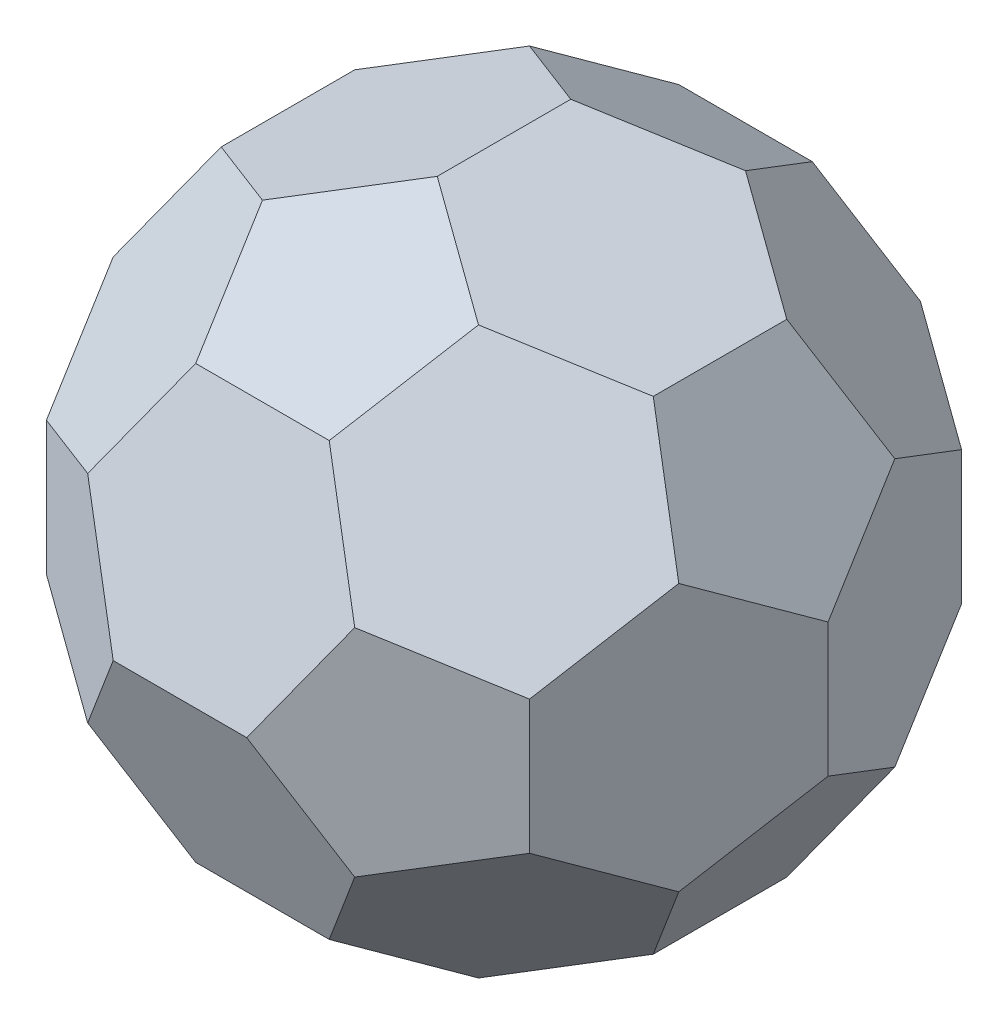
ISO-10303-21;
HEADER;
FILE_DESCRIPTION(('STEP AP214'),'2;1');
FILE_NAME('part.step','',(''),(''),'','','');
FILE_SCHEMA(('AUTOMOTIVE_DESIGN { 1 0 10303 214 1 1 1 1 }'));
ENDSEC;
DATA;
#1=APPLICATION_CONTEXT('core data for automotive mechanical design processes');
#2=APPLICATION_PROTOCOL_DEFINITION('international standard','automotive_design',2000,#1);
#3=PRODUCT_CONTEXT('',#1,'mechanical');
#4=PRODUCT('Part','Part','',(#3));
#5=PRODUCT_RELATED_PRODUCT_CATEGORY('part','',(#4));
#6=PRODUCT_DEFINITION_FORMATION('','',#4);
#7=PRODUCT_DEFINITION_CONTEXT('part definition',#1,'design');
#8=PRODUCT_DEFINITION('design','',#6,#7);
#9=PRODUCT_DEFINITION_SHAPE('','',#8);
#10=(LENGTH_UNIT() NAMED_UNIT(*) SI_UNIT(.MILLI.,.METRE.));
#11=(NAMED_UNIT(*) PLANE_ANGLE_UNIT() SI_UNIT($,.RADIAN.));
#12=(NAMED_UNIT(*) SI_UNIT($,.STERADIAN.) SOLID_ANGLE_UNIT());
#13=UNCERTAINTY_MEASURE_WITH_UNIT(LENGTH_MEASURE(1.E-05),#10,'distance_accuracy_value','');
#14=(GEOMETRIC_REPRESENTATION_CONTEXT(3) GLOBAL_UNCERTAINTY_ASSIGNED_CONTEXT((#13)) GLOBAL_UNIT_ASSIGNED_CONTEXT((#10,
#11,#12)) REPRESENTATION_CONTEXT('',''));
#15=CARTESIAN_POINT('',(0.,0.,0.));
#16=DIRECTION('',(0.,0.,1.));
#17=DIRECTION('',(1.,0.,0.));
#18=AXIS2_PLACEMENT_3D('',#15,#16,#17);
#19=CARTESIAN_POINT('',(29.0744913757677,0.,-47.0435152516077));
#20=DIRECTION('',(0.,0.356822089773093,0.934172358962715));
#21=DIRECTION('',(0.925614793410956,0.353553390593278,-0.135045378368864));
#22=AXIS2_PLACEMENT_3D('',#19,#20,#21);
#23=PLANE('',#22);
#24=DIRECTION('',(-0.500000000000016,0.809016994374937,-0.309016994374948));
#25=VECTOR('',#24,1.);
#26=CARTESIAN_POINT('',(14.5372456878839,-7.84058587526825,-44.0486779389676));
#27=LINE('',#26,#25);
#28=CARTESIAN_POINT('',(19.3829942505119,-15.6811717505359,-41.0538406263277));
#29=VERTEX_POINT('',#28);
#30=CARTESIAN_POINT('',(9.69149712525565,0.,-47.0435152516077));
#31=VERTEX_POINT('',#30);
#32=EDGE_CURVE('E286',#29,#31,#27,.T.);
#33=ORIENTED_EDGE('',*,*,#32,.F.);
#34=DIRECTION('',(-0.499999999999994,-0.80901699437495,0.309016994374951));
#35=VECTOR('',#34,1.);
#36=CARTESIAN_POINT('',(29.0744913757676,0.,-47.0435152516078));
#37=LINE('',#36,#35);
#38=CARTESIAN_POINT('',(9.69149712525601,-31.3623435010721,-35.0641660010475));
#39=VERTEX_POINT('',#38);
#40=EDGE_CURVE('E438',#29,#39,#37,.T.);
#41=ORIENTED_EDGE('',*,*,#40,.T.);
#42=DIRECTION('',(-1.,0.,0.));
#43=VECTOR('',#42,1.);
#44=CARTESIAN_POINT('',(29.0744913757684,-31.3623435010717,-35.0641660010476));
#45=LINE('',#44,#43);
#46=CARTESIAN_POINT('',(-9.69149712525543,-31.3623435010725,-35.0641660010474));
#47=VERTEX_POINT('',#46);
#48=EDGE_CURVE('E336',#39,#47,#45,.T.);
#49=ORIENTED_EDGE('',*,*,#48,.T.);
#50=DIRECTION('',(-0.500000000000004,0.809016994374944,-0.30901699437495));
#51=VECTOR('',#50,1.);
#52=CARTESIAN_POINT('',(2.16259849293508E-13,-47.0435152516078,-29.0744913757675));
#53=LINE('',#52,#51);
#54=CARTESIAN_POINT('',(-19.3829942505118,-15.681171750536,-41.0538406263277));
#55=VERTEX_POINT('',#54);
#56=EDGE_CURVE('E447',#47,#55,#53,.T.);
#57=ORIENTED_EDGE('',*,*,#56,.T.);
#58=DIRECTION('',(0.499999999999993,0.80901699437495,-0.309016994374951));
#59=VECTOR('',#58,1.);
#60=CARTESIAN_POINT('',(-3.46831833772607E-13,15.6811717505358,-53.0331898768878));
#61=LINE('',#60,#59);
#62=CARTESIAN_POINT('',(-9.6914971252561,-1.42813108024015E-13,-47.0435152516078));
#63=VERTEX_POINT('',#62);
#64=EDGE_CURVE('E349',#55,#63,#61,.T.);
#65=ORIENTED_EDGE('',*,*,#64,.T.);
#66=DIRECTION('',(1.,0.,0.));
#67=VECTOR('',#66,1.);
#68=CARTESIAN_POINT('',(-29.0744913757676,-1.40772920766529E-13,-47.0435152516077));
#69=LINE('',#68,#67);
#70=EDGE_CURVE('E413',#63,#31,#69,.T.);
#71=ORIENTED_EDGE('',*,*,#70,.T.);
#72=EDGE_LOOP('',(#33,#41,#49,#57,#65,#71));
#73=FACE_BOUND('',#72,.T.);
#74=ADVANCED_FACE('F51',(#73),#23,.F.);
#75=CARTESIAN_POINT('',(29.0744913757676,0.,-47.0435152516078));
#76=DIRECTION('',(-0.57735026918963,0.577350269189624,0.577350269189623));
#77=DIRECTION('',(0.218508012224405,0.790569415042094,-0.572061402817688));
#78=AXIS2_PLACEMENT_3D('',#75,#76,#77);
#79=PLANE('',#78);
#80=DIRECTION('',(-0.809016994374946,-0.309016994374966,-0.49999999999999));
#81=VECTOR('',#80,1.);
#82=CARTESIAN_POINT('',(27.22358012578,-12.6863344378956,-36.2080920636997));
#83=LINE('',#82,#81);
#84=CARTESIAN_POINT('',(35.0641660010476,-9.69149712525554,-31.3623435010721));
#85=VERTEX_POINT('',#84);
#86=EDGE_CURVE('E283',#85,#29,#83,.T.);
#87=ORIENTED_EDGE('',*,*,#86,.F.);
#88=DIRECTION('',(0.309016994374952,-0.499999999999992,0.80901699437495));
#89=VECTOR('',#88,1.);
#90=CARTESIAN_POINT('',(29.0744913757676,0.,-47.0435152516077));
#91=LINE('',#90,#89);
#92=CARTESIAN_POINT('',(41.053840626328,-19.3829942505116,-15.6811717505356));
#93=VERTEX_POINT('',#92);
#94=EDGE_CURVE('E406',#85,#93,#91,.T.);
#95=ORIENTED_EDGE('',*,*,#94,.T.);
#96=DIRECTION('',(-0.499999999999984,-0.809016994374951,0.309016994374963));
#97=VECTOR('',#96,1.);
#98=CARTESIAN_POINT('',(50.7453377515838,-3.70182249997514,-21.6708463758162));
#99=LINE('',#98,#97);
#100=CARTESIAN_POINT('',(31.3623435010726,-35.0641660010473,-9.69149712525542));
#101=VERTEX_POINT('',#100);
#102=EDGE_CURVE('E328',#93,#101,#99,.T.);
#103=ORIENTED_EDGE('',*,*,#102,.T.);
#104=DIRECTION('',(-0.809016994374945,-0.309016994374956,-0.499999999999999));
#105=VECTOR('',#104,1.);
#106=CARTESIAN_POINT('',(47.0435152516079,-29.0744913757673,1.38732733509043E-13));
#107=LINE('',#106,#105);
#108=CARTESIAN_POINT('',(15.6811717505361,-41.0538406263277,-19.3829942505117));
#109=VERTEX_POINT('',#108);
#110=EDGE_CURVE('E437',#101,#109,#107,.T.);
#111=ORIENTED_EDGE('',*,*,#110,.T.);
#112=DIRECTION('',(-0.309016994374954,0.499999999999992,-0.80901699437495));
#113=VECTOR('',#112,1.);
#114=CARTESIAN_POINT('',(3.70182249997585,-21.6708463758164,-50.7453377515834));
#115=LINE('',#114,#113);
#116=EDGE_CURVE('E497',#109,#39,#115,.T.);
#117=ORIENTED_EDGE('',*,*,#116,.T.);
#118=ORIENTED_EDGE('',*,*,#40,.F.);
#119=EDGE_LOOP('',(#87,#95,#103,#111,#117,#118));
#120=FACE_BOUND('',#119,.T.);
#121=ADVANCED_FACE('F572',(#120),#79,.F.);
#122=CARTESIAN_POINT('',(29.0744913757676,0.,-47.0435152516077));
#123=DIRECTION('',(0.,-0.356822089773088,0.934172358962716));
#124=DIRECTION('',(0.790569415042096,-0.572061402817683,-0.21850801222441));
#125=AXIS2_PLACEMENT_3D('',#122,#123,#124);
#126=PLANE('',#125);
#127=DIRECTION('',(0.500000000000002,0.809016994374947,0.309016994374945));
#128=VECTOR('',#127,1.);
#129=CARTESIAN_POINT('',(14.5372456878837,7.84058587526805,-44.0486779389677));
#130=LINE('',#129,#128);
#131=CARTESIAN_POINT('',(19.3829942505117,15.681171750536,-41.0538406263277));
#132=VERTEX_POINT('',#131);
#133=EDGE_CURVE('E280',#31,#132,#130,.T.);
#134=ORIENTED_EDGE('',*,*,#133,.F.);
#135=ORIENTED_EDGE('',*,*,#70,.F.);
#136=DIRECTION('',(-0.500000000000016,0.809016994374939,0.309016994374943));
#137=VECTOR('',#136,1.);
#138=CARTESIAN_POINT('',(3.91715953437297E-13,-15.6811717505364,-53.0331898768879));
#139=LINE('',#138,#137);
#140=CARTESIAN_POINT('',(-19.3829942505121,15.6811717505353,-41.0538406263279));
#141=VERTEX_POINT('',#140);
#142=EDGE_CURVE('E494',#63,#141,#139,.T.);
#143=ORIENTED_EDGE('',*,*,#142,.T.);
#144=DIRECTION('',(0.499999999999998,0.809016994374949,0.309016994374946));
#145=VECTOR('',#144,1.);
#146=CARTESIAN_POINT('',(-29.0744913757676,-1.40772920766529E-13,-47.0435152516077));
#147=LINE('',#146,#145);
#148=CARTESIAN_POINT('',(-9.69149712525587,31.3623435010719,-35.0641660010477));
#149=VERTEX_POINT('',#148);
#150=EDGE_CURVE('E409',#141,#149,#147,.T.);
#151=ORIENTED_EDGE('',*,*,#150,.T.);
#152=DIRECTION('',(1.,0.,0.));
#153=VECTOR('',#152,1.);
#154=CARTESIAN_POINT('',(29.0744913757675,31.3623435010721,-35.0641660010476));
#155=LINE('',#154,#153);
#156=CARTESIAN_POINT('',(9.69149712525575,31.362343501072,-35.0641660010476));
#157=VERTEX_POINT('',#156);
#158=EDGE_CURVE('E359',#149,#157,#155,.T.);
#159=ORIENTED_EDGE('',*,*,#158,.T.);
#160=DIRECTION('',(0.5,-0.809016994374947,-0.309016994374948));
#161=VECTOR('',#160,1.);
#162=CARTESIAN_POINT('',(0.,47.0435152516077,-29.0744913757676));
#163=LINE('',#162,#161);
#164=EDGE_CURVE('E388',#157,#132,#163,.T.);
#165=ORIENTED_EDGE('',*,*,#164,.T.);
#166=EDGE_LOOP('',(#134,#135,#143,#151,#159,#165));
#167=FACE_BOUND('',#166,.T.);
#168=ADVANCED_FACE('F522',(#167),#126,.F.);
#169=CARTESIAN_POINT('',(29.0744913757676,0.,-47.0435152516077));
#170=DIRECTION('',(-0.934172358962716,0.,0.35682208977309));
#171=DIRECTION('',(-0.353553390593275,0.135045378368854,-0.925614793410959));
#172=AXIS2_PLACEMENT_3D('',#169,#170,#171);
#173=PLANE('',#172);
#174=DIRECTION('',(0.,-1.,0.));
#175=VECTOR('',#174,1.);
#176=CARTESIAN_POINT('',(35.0641660010476,0.,-31.3623435010721));
#177=LINE('',#176,#175);
#178=CARTESIAN_POINT('',(35.0641660010476,9.69149712525576,-31.362343501072));
#179=VERTEX_POINT('',#178);
#180=EDGE_CURVE('E277',#179,#85,#177,.T.);
#181=ORIENTED_EDGE('',*,*,#180,.F.);
#182=DIRECTION('',(0.309016994374947,0.5,0.809016994374947));
#183=VECTOR('',#182,1.);
#184=CARTESIAN_POINT('',(29.0744913757676,0.,-47.0435152516077));
#185=LINE('',#184,#183);
#186=CARTESIAN_POINT('',(41.0538406263278,19.3829942505119,-15.6811717505357));
#187=VERTEX_POINT('',#186);
#188=EDGE_CURVE('E392',#179,#187,#185,.T.);
#189=ORIENTED_EDGE('',*,*,#188,.T.);
#190=DIRECTION('',(0.309016994374952,-0.499999999999993,0.80901699437495));
#191=VECTOR('',#190,1.);
#192=CARTESIAN_POINT('',(35.0641660010474,29.074491375768,-31.3623435010719));
#193=LINE('',#192,#191);
#194=CARTESIAN_POINT('',(47.0435152516077,9.69149712525643,1.71375729628817E-13));
#195=VERTEX_POINT('',#194);
#196=EDGE_CURVE('E379',#187,#195,#193,.T.);
#197=ORIENTED_EDGE('',*,*,#196,.T.);
#198=DIRECTION('',(0.,-1.,0.));
#199=VECTOR('',#198,1.);
#200=CARTESIAN_POINT('',(47.0435152516074,29.0744913757681,-1.59134606083902E-13));
#201=LINE('',#200,#199);
#202=CARTESIAN_POINT('',(47.0435152516079,-9.69149712525554,1.71375729628817E-13));
#203=VERTEX_POINT('',#202);
#204=EDGE_CURVE('E403',#195,#203,#201,.T.);
#205=ORIENTED_EDGE('',*,*,#204,.T.);
#206=DIRECTION('',(-0.309016994374942,-0.500000000000011,-0.809016994374943));
#207=VECTOR('',#206,1.);
#208=CARTESIAN_POINT('',(35.064166001048,-29.0744913757677,-31.3623435010714));
#209=LINE('',#208,#207);
#210=EDGE_CURVE('E500',#203,#93,#209,.T.);
#211=ORIENTED_EDGE('',*,*,#210,.T.);
#212=ORIENTED_EDGE('',*,*,#94,.F.);
#213=EDGE_LOOP('',(#181,#189,#197,#205,#211,#212));
#214=FACE_BOUND('',#213,.T.);
#215=ADVANCED_FACE('F550',(#214),#173,.F.);
#216=CARTESIAN_POINT('',(29.0744913757676,0.,-47.0435152516077));
#217=DIRECTION('',(-0.577350269189626,-0.577350269189626,0.577350269189626));
#218=DIRECTION('',(0.,-0.707106781186547,-0.707106781186548));
#219=AXIS2_PLACEMENT_3D('',#216,#217,#218);
#220=PLANE('',#219);
#221=DIRECTION('',(0.809016994374949,-0.30901699437496,0.499999999999989));
#222=VECTOR('',#221,1.);
#223=CARTESIAN_POINT('',(27.2235801257799,12.6863344378958,-36.2080920636997));
#224=LINE('',#223,#222);
#225=EDGE_CURVE('E59',#132,#179,#224,.T.);
#226=ORIENTED_EDGE('',*,*,#225,.F.);
#227=ORIENTED_EDGE('',*,*,#164,.F.);
#228=DIRECTION('',(0.309016994374935,0.50000000000001,0.809016994374946));
#229=VECTOR('',#228,1.);
#230=CARTESIAN_POINT('',(3.70182249997574,21.6708463758156,-50.745337751584));
#231=LINE('',#230,#229);
#232=CARTESIAN_POINT('',(15.6811717505354,41.0538406263279,-19.3829942505121));
#233=VERTEX_POINT('',#232);
#234=EDGE_CURVE('E491',#157,#233,#231,.T.);
#235=ORIENTED_EDGE('',*,*,#234,.T.);
#236=DIRECTION('',(0.809016994374948,-0.309016994374947,0.5));
#237=VECTOR('',#236,1.);
#238=CARTESIAN_POINT('',(0.,47.0435152516077,-29.0744913757676));
#239=LINE('',#238,#237);
#240=CARTESIAN_POINT('',(31.362343501072,35.0641660010476,-9.6914971252558));
#241=VERTEX_POINT('',#240);
#242=EDGE_CURVE('E396',#233,#241,#239,.T.);
#243=ORIENTED_EDGE('',*,*,#242,.T.);
#244=DIRECTION('',(0.500000000000002,-0.809016994374947,-0.309016994374945));
#245=VECTOR('',#244,1.);
#246=CARTESIAN_POINT('',(50.7453377515837,3.70182249997597,-21.6708463758157));
#247=LINE('',#246,#245);
#248=EDGE_CURVE('E399',#241,#187,#247,.T.);
#249=ORIENTED_EDGE('',*,*,#248,.T.);
#250=ORIENTED_EDGE('',*,*,#188,.F.);
#251=EDGE_LOOP('',(#226,#227,#235,#243,#249,#250));
#252=FACE_BOUND('',#251,.T.);
#253=ADVANCED_FACE('F520',(#252),#220,.F.);
#254=CARTESIAN_POINT('',(1.35162405808442E-13,-47.0435152516077,29.0744913757677));
#255=DIRECTION('',(-0.577350269189624,-0.577350269189626,0.577350269189627));
#256=DIRECTION('',(-0.11026408970827,0.755761314076171,0.645497224367902));
#257=AXIS2_PLACEMENT_3D('',#254,#255,#256);
#258=PLANE('',#257);
#259=DIRECTION('',(0.809016994374947,-0.309016994374939,0.500000000000006));
#260=VECTOR('',#259,1.);
#261=CARTESIAN_POINT('',(-3.70182249997605,-21.6708463758154,50.7453377515839));
#262=LINE('',#261,#260);
#263=CARTESIAN_POINT('',(-35.0641660010476,-9.69149712525573,31.3623435010721));
#264=VERTEX_POINT('',#263);
#265=CARTESIAN_POINT('',(-19.3829942505119,-15.6811717505355,41.0538406263279));
#266=VERTEX_POINT('',#265);
#267=EDGE_CURVE('E66',#264,#266,#262,.T.);
#268=ORIENTED_EDGE('',*,*,#267,.F.);
#269=DIRECTION('',(0.309016994374947,0.5,0.809016994374947));
#270=VECTOR('',#269,1.);
#271=CARTESIAN_POINT('',(-47.0435152516077,-29.0744913757677,0.));
#272=LINE('',#271,#270);
#273=CARTESIAN_POINT('',(-41.0538406263278,-19.3829942505119,15.6811717505357));
#274=VERTEX_POINT('',#273);
#275=EDGE_CURVE('E480',#274,#264,#272,.T.);
#276=ORIENTED_EDGE('',*,*,#275,.F.);
#277=DIRECTION('',(-0.500000000000015,0.809016994374944,0.309016994374931));
#278=VECTOR('',#277,1.);
#279=CARTESIAN_POINT('',(-21.6708463758151,-50.7453377515841,3.70182249997611));
#280=LINE('',#279,#278);
#281=CARTESIAN_POINT('',(-31.3623435010715,-35.0641660010479,9.69149712525607));
#282=VERTEX_POINT('',#281);
#283=EDGE_CURVE('E314',#282,#274,#280,.T.);
#284=ORIENTED_EDGE('',*,*,#283,.F.);
#285=DIRECTION('',(0.809016994374951,-0.309016994374936,0.500000000000001));
#286=VECTOR('',#285,1.);
#287=CARTESIAN_POINT('',(-47.0435152516075,-29.0744913757681,1.83616853173733E-13));
#288=LINE('',#287,#286);
#289=CARTESIAN_POINT('',(-15.6811717505351,-41.0538406263279,19.3829942505122));
#290=VERTEX_POINT('',#289);
#291=EDGE_CURVE('E387',#282,#290,#288,.T.);
#292=ORIENTED_EDGE('',*,*,#291,.T.);
#293=DIRECTION('',(-0.309016994374932,-0.500000000000014,-0.809016994374945));
#294=VECTOR('',#293,1.);
#295=CARTESIAN_POINT('',(-12.6863344378956,-36.2080920637002,27.2235801257796));
#296=LINE('',#295,#294);
#297=CARTESIAN_POINT('',(-9.6914971252556,-31.362343501072,35.0641660010477));
#298=VERTEX_POINT('',#297);
#299=EDGE_CURVE('E305',#298,#290,#296,.T.);
#300=ORIENTED_EDGE('',*,*,#299,.F.);
#301=DIRECTION('',(-0.500000000000004,0.809016994374946,0.309016994374945));
#302=VECTOR('',#301,1.);
#303=CARTESIAN_POINT('',(2.08099100263564E-13,-47.0435152516076,29.0744913757678));
#304=LINE('',#303,#302);
#305=EDGE_CURVE('E477',#298,#266,#304,.T.);
#306=ORIENTED_EDGE('',*,*,#305,.T.);
#307=EDGE_LOOP('',(#268,#276,#284,#292,#300,#306));
#308=FACE_BOUND('',#307,.T.);
#309=ADVANCED_FACE('F53',(#308),#258,.T.);
#310=CARTESIAN_POINT('',(4.6516269470679E-13,-47.0435152516075,29.0744913757679));
#311=DIRECTION('',(0.356822089773081,0.934172358962719,0.));
#312=DIRECTION('',(-0.572061402817686,0.21850801222441,0.790569415042093));
#313=AXIS2_PLACEMENT_3D('',#310,#311,#312);
#314=PLANE('',#313);
#315=DIRECTION('',(0.,0.,-1.));
#316=VECTOR('',#315,1.);
#317=CARTESIAN_POINT('',(1.34652358994071E-13,-47.0435152516077,29.0744913757677));
#318=LINE('',#317,#316);
#319=CARTESIAN_POINT('',(1.25471516335384E-13,-47.0435152516077,9.69149712525637));
#320=VERTEX_POINT('',#319);
#321=CARTESIAN_POINT('',(1.22411235449155E-13,-47.0435152516078,-9.6914971252561));
#322=VERTEX_POINT('',#321);
#323=EDGE_CURVE('E459',#320,#322,#318,.T.);
#324=ORIENTED_EDGE('',*,*,#323,.F.);
#325=DIRECTION('',(-0.809016994374946,0.309016994374941,0.500000000000006));
#326=VECTOR('',#325,1.);
#327=CARTESIAN_POINT('',(-7.84058587526748,-44.0486779389677,14.5372456878844));
#328=LINE('',#327,#326);
#329=EDGE_CURVE('E302',#320,#290,#328,.T.);
#330=ORIENTED_EDGE('',*,*,#329,.T.);
#331=ORIENTED_EDGE('',*,*,#291,.F.);
#332=DIRECTION('',(0.,0.,-1.));
#333=VECTOR('',#332,1.);
#334=CARTESIAN_POINT('',(-31.3623435010716,-35.0641660010478,29.0744913757678));
#335=LINE('',#334,#333);
#336=CARTESIAN_POINT('',(-31.3623435010717,-35.0641660010477,-9.69149712525595));
#337=VERTEX_POINT('',#336);
#338=EDGE_CURVE('E311',#282,#337,#335,.T.);
#339=ORIENTED_EDGE('',*,*,#338,.T.);
#340=DIRECTION('',(-0.809016994374947,0.309016994374947,0.5));
#341=VECTOR('',#340,1.);
#342=CARTESIAN_POINT('',(0.,-47.0435152516077,-29.0744913757676));
#343=LINE('',#342,#341);
#344=CARTESIAN_POINT('',(-15.6811717505353,-41.0538406263279,-19.3829942505121));
#345=VERTEX_POINT('',#344);
#346=EDGE_CURVE('E470',#345,#337,#343,.T.);
#347=ORIENTED_EDGE('',*,*,#346,.F.);
#348=DIRECTION('',(0.809016994374948,-0.309016994374935,0.500000000000007));
#349=VECTOR('',#348,1.);
#350=CARTESIAN_POINT('',(15.6811717505367,-53.0331898768877,1.95857976718649E-13));
#351=LINE('',#350,#349);
#352=EDGE_CURVE('E344',#345,#322,#351,.T.);
#353=ORIENTED_EDGE('',*,*,#352,.T.);
#354=EDGE_LOOP('',(#324,#330,#331,#339,#347,#353));
#355=FACE_BOUND('',#354,.T.);
#356=ADVANCED_FACE('F598',(#355),#314,.F.);
#357=CARTESIAN_POINT('',(-47.0435152516077,-29.0744913757677,0.));
#358=DIRECTION('',(-0.934172358962716,0.,0.35682208977309));
#359=DIRECTION('',(0.35682208977309,0.,0.934172358962716));
#360=AXIS2_PLACEMENT_3D('',#357,#358,#359);
#361=PLANE('',#360);
#362=DIRECTION('',(0.,-1.,0.));
#363=VECTOR('',#362,1.);
#364=CARTESIAN_POINT('',(-35.0641660010475,-29.0744913757672,31.3623435010723));
#365=LINE('',#364,#363);
#366=CARTESIAN_POINT('',(-35.0641660010477,9.69149712525568,31.3623435010718));
#367=VERTEX_POINT('',#366);
#368=EDGE_CURVE('E272',#367,#264,#365,.T.);
#369=ORIENTED_EDGE('',*,*,#368,.F.);
#370=DIRECTION('',(0.309016994374952,-0.499999999999992,0.80901699437495));
#371=VECTOR('',#370,1.);
#372=CARTESIAN_POINT('',(-47.043515251608,29.0744913757672,-1.85657040431219E-13));
#373=LINE('',#372,#371);
#374=CARTESIAN_POINT('',(-41.053840626328,19.3829942505116,15.6811717505356));
#375=VERTEX_POINT('',#374);
#376=EDGE_CURVE('E260',#375,#367,#373,.T.);
#377=ORIENTED_EDGE('',*,*,#376,.F.);
#378=DIRECTION('',(0.309016994374944,0.500000000000017,0.809016994374938));
#379=VECTOR('',#378,1.);
#380=CARTESIAN_POINT('',(-53.0331898768879,-7.71190783329679E-13,-15.6811717505362));
#381=LINE('',#380,#379);
#382=CARTESIAN_POINT('',(-47.0435152516079,9.69149712525548,1.40772920766529E-13));
#383=VERTEX_POINT('',#382);
#384=EDGE_CURVE('E323',#383,#375,#381,.T.);
#385=ORIENTED_EDGE('',*,*,#384,.F.);
#386=DIRECTION('',(0.,-1.,0.));
#387=VECTOR('',#386,1.);
#388=CARTESIAN_POINT('',(-47.043515251608,29.0744913757673,-1.22411235449155E-13));
#389=LINE('',#388,#387);
#390=CARTESIAN_POINT('',(-47.0435152516077,-9.6914971252567,0.));
#391=VERTEX_POINT('',#390);
#392=EDGE_CURVE('E465',#383,#391,#389,.T.);
#393=ORIENTED_EDGE('',*,*,#392,.T.);
#394=DIRECTION('',(-0.309016994374951,0.499999999999984,-0.809016994374956));
#395=VECTOR('',#394,1.);
#396=CARTESIAN_POINT('',(-44.0486779389679,-14.537245687884,7.8405858752675));
#397=LINE('',#396,#395);
#398=EDGE_CURVE('E309',#274,#391,#397,.T.);
#399=ORIENTED_EDGE('',*,*,#398,.F.);
#400=ORIENTED_EDGE('',*,*,#275,.T.);
#401=EDGE_LOOP('',(#369,#377,#385,#393,#399,#400));
#402=FACE_BOUND('',#401,.T.);
#403=ADVANCED_FACE('F591',(#402),#361,.T.);
#404=CARTESIAN_POINT('',(29.0744913757676,3.01437667293545E-13,47.0435152516077));
#405=DIRECTION('',(0.,-0.356822089773087,0.934172358962717));
#406=DIRECTION('',(-0.866025403784441,0.467086179481354,0.178411044886544));
#407=AXIS2_PLACEMENT_3D('',#404,#405,#406);
#408=PLANE('',#407);
#409=DIRECTION('',(0.500000000000003,0.809016994374947,0.309016994374944));
#410=VECTOR('',#409,1.);
#411=CARTESIAN_POINT('',(0.,15.6811717505364,53.0331898768878));
#412=LINE('',#411,#410);
#413=CARTESIAN_POINT('',(-9.69149712525622,1.46176042547663E-13,47.0435152516077));
#414=VERTEX_POINT('',#413);
#415=EDGE_CURVE('E74',#266,#414,#412,.T.);
#416=ORIENTED_EDGE('',*,*,#415,.F.);
#417=ORIENTED_EDGE('',*,*,#305,.F.);
#418=DIRECTION('',(-1.,0.,0.));
#419=VECTOR('',#418,1.);
#420=CARTESIAN_POINT('',(29.0744913757685,-31.3623435010711,35.0641660010479));
#421=LINE('',#420,#419);
#422=CARTESIAN_POINT('',(9.69149712525606,-31.3623435010715,35.0641660010478));
#423=VERTEX_POINT('',#422);
#424=EDGE_CURVE('E300',#423,#298,#421,.T.);
#425=ORIENTED_EDGE('',*,*,#424,.F.);
#426=DIRECTION('',(0.5,0.809016994374948,0.309016994374947));
#427=VECTOR('',#426,1.);
#428=CARTESIAN_POINT('',(0.,-47.0435152516077,29.0744913757677));
#429=LINE('',#428,#427);
#430=CARTESIAN_POINT('',(19.3829942505122,-15.6811717505353,41.053840626328));
#431=VERTEX_POINT('',#430);
#432=EDGE_CURVE('E455',#423,#431,#429,.T.);
#433=ORIENTED_EDGE('',*,*,#432,.T.);
#434=DIRECTION('',(0.50000000000002,-0.809016994374937,-0.309016994374942));
#435=VECTOR('',#434,1.);
#436=CARTESIAN_POINT('',(14.5372456878844,-7.8405858752678,44.0486779389677));
#437=LINE('',#436,#435);
#438=CARTESIAN_POINT('',(9.69149712525596,0.,47.0435152516078));
#439=VERTEX_POINT('',#438);
#440=EDGE_CURVE('E296',#439,#431,#437,.T.);
#441=ORIENTED_EDGE('',*,*,#440,.F.);
#442=DIRECTION('',(-1.,0.,0.));
#443=VECTOR('',#442,1.);
#444=CARTESIAN_POINT('',(29.0744913757676,4.24358949557072E-13,47.0435152516077));
#445=LINE('',#444,#443);
#446=EDGE_CURVE('E259',#439,#414,#445,.T.);
#447=ORIENTED_EDGE('',*,*,#446,.T.);
#448=EDGE_LOOP('',(#416,#417,#425,#433,#441,#447));
#449=FACE_BOUND('',#448,.T.);
#450=ADVANCED_FACE('F603',(#449),#408,.T.);
#451=CARTESIAN_POINT('',(-47.0435152516077,-29.0744913757677,0.));
#452=DIRECTION('',(-0.577350269189626,-0.577350269189626,-0.577350269189626));
#453=DIRECTION('',(-0.707106781186547,0.,0.707106781186547));
#454=AXIS2_PLACEMENT_3D('',#451,#452,#453);
#455=PLANE('',#454);
#456=DIRECTION('',(0.500000000000017,-0.809016994374945,0.309016994374928));
#457=VECTOR('',#456,1.);
#458=CARTESIAN_POINT('',(-36.2080920637,-27.2235801257794,-12.6863344378959));
#459=LINE('',#458,#457);
#460=CARTESIAN_POINT('',(-41.0538406263276,-19.3829942505123,-15.6811717505356));
#461=VERTEX_POINT('',#460);
#462=EDGE_CURVE('E307',#461,#337,#459,.T.);
#463=ORIENTED_EDGE('',*,*,#462,.F.);
#464=DIRECTION('',(-0.309016994374943,-0.499999999999998,0.80901699437495));
#465=VECTOR('',#464,1.);
#466=CARTESIAN_POINT('',(-29.0744913757676,-4.44760822131931E-13,-47.0435152516078));
#467=LINE('',#466,#465);
#468=CARTESIAN_POINT('',(-35.0641660010475,-9.6914971252561,-31.3623435010721));
#469=VERTEX_POINT('',#468);
#470=EDGE_CURVE('E466',#469,#461,#467,.T.);
#471=ORIENTED_EDGE('',*,*,#470,.F.);
#472=DIRECTION('',(-0.809016994374949,0.309016994374957,0.499999999999992));
#473=VECTOR('',#472,1.);
#474=CARTESIAN_POINT('',(-50.7453377515833,-3.70182249997559,-21.6708463758165));
#475=LINE('',#474,#473);
#476=EDGE_CURVE('E355',#55,#469,#475,.T.);
#477=ORIENTED_EDGE('',*,*,#476,.F.);
#478=ORIENTED_EDGE('',*,*,#56,.F.);
#479=DIRECTION('',(0.309016994374947,0.5,-0.809016994374947));
#480=VECTOR('',#479,1.);
#481=CARTESIAN_POINT('',(-21.6708463758154,-50.745337751584,-3.70182249997593));
#482=LINE('',#481,#480);
#483=EDGE_CURVE('E342',#345,#47,#482,.T.);
#484=ORIENTED_EDGE('',*,*,#483,.F.);
#485=ORIENTED_EDGE('',*,*,#346,.T.);
#486=EDGE_LOOP('',(#463,#471,#477,#478,#484,#485));
#487=FACE_BOUND('',#486,.T.);
#488=ADVANCED_FACE('F642',(#487),#455,.T.);
#489=CARTESIAN_POINT('',(-47.0435152516075,-29.074491375768,1.34652358994071E-13));
#490=DIRECTION('',(0.934172358962716,0.,0.356822089773089));
#491=DIRECTION('',(-0.353553390593274,0.135045378368865,0.925614793410958));
#492=AXIS2_PLACEMENT_3D('',#489,#490,#491);
#493=PLANE('',#492);
#494=ORIENTED_EDGE('',*,*,#470,.T.);
#495=DIRECTION('',(-0.309016994374952,0.499999999999994,0.809016994374949));
#496=VECTOR('',#495,1.);
#497=CARTESIAN_POINT('',(-44.0486779389677,-14.5372456878844,-7.84058587526763));
#498=LINE('',#497,#496);
#499=EDGE_CURVE('E506',#461,#391,#498,.T.);
#500=ORIENTED_EDGE('',*,*,#499,.T.);
#501=ORIENTED_EDGE('',*,*,#392,.F.);
#502=DIRECTION('',(0.309016994374943,0.499999999999997,-0.809016994374951));
#503=VECTOR('',#502,1.);
#504=CARTESIAN_POINT('',(-53.0331898768878,-1.9993835123362E-13,15.6811717505359));
#505=LINE('',#504,#503);
#506=CARTESIAN_POINT('',(-41.0538406263279,19.3829942505113,-15.681171750536));
#507=VERTEX_POINT('',#506);
#508=EDGE_CURVE('E320',#383,#507,#505,.T.);
#509=ORIENTED_EDGE('',*,*,#508,.T.);
#510=DIRECTION('',(-0.309016994374952,0.500000000000002,0.809016994374944));
#511=VECTOR('',#510,1.);
#512=CARTESIAN_POINT('',(-29.0744913757676,-5.69212244838572E-13,-47.0435152516077));
#513=LINE('',#512,#511);
#514=CARTESIAN_POINT('',(-35.0641660010476,9.69149712525508,-31.3623435010723));
#515=VERTEX_POINT('',#514);
#516=EDGE_CURVE('E441',#515,#507,#513,.T.);
#517=ORIENTED_EDGE('',*,*,#516,.F.);
#518=DIRECTION('',(0.,-1.,0.));
#519=VECTOR('',#518,1.);
#520=CARTESIAN_POINT('',(-35.0641660010473,-29.0744913757682,-31.362343501072));
#521=LINE('',#520,#519);
#522=EDGE_CURVE('E352',#515,#469,#521,.T.);
#523=ORIENTED_EDGE('',*,*,#522,.T.);
#524=EDGE_LOOP('',(#494,#500,#501,#509,#517,#523));
#525=FACE_BOUND('',#524,.T.);
#526=ADVANCED_FACE('F584',(#525),#493,.F.);
#527=CARTESIAN_POINT('',(1.34967585261206E-13,-47.0435152516077,29.0744913757677));
#528=DIRECTION('',(0.356822089773092,-0.934172358962715,0.));
#529=DIRECTION('',(-0.572061402817684,-0.218508012224411,0.790569415042095));
#530=AXIS2_PLACEMENT_3D('',#527,#528,#529);
#531=PLANE('',#530);
#532=DIRECTION('',(0.809016994374959,0.309016994374955,0.499999999999977));
#533=VECTOR('',#532,1.);
#534=CARTESIAN_POINT('',(7.84058587526767,-44.0486779389678,14.5372456878838));
#535=LINE('',#534,#533);
#536=CARTESIAN_POINT('',(15.6811717505361,-41.0538406263276,19.3829942505116));
#537=VERTEX_POINT('',#536);
#538=EDGE_CURVE('E298',#320,#537,#535,.T.);
#539=ORIENTED_EDGE('',*,*,#538,.F.);
#540=ORIENTED_EDGE('',*,*,#323,.T.);
#541=DIRECTION('',(-0.809016994374953,-0.309016994374951,0.499999999999989));
#542=VECTOR('',#541,1.);
#543=CARTESIAN_POINT('',(-15.6811717505356,-53.0331898768878,-5.87573930155946E-13));
#544=LINE('',#543,#542);
#545=EDGE_CURVE('E339',#109,#322,#544,.T.);
#546=ORIENTED_EDGE('',*,*,#545,.F.);
#547=ORIENTED_EDGE('',*,*,#110,.F.);
#548=DIRECTION('',(0.,0.,-1.));
#549=VECTOR('',#548,1.);
#550=CARTESIAN_POINT('',(31.3623435010725,-35.0641660010473,29.0744913757677));
#551=LINE('',#550,#549);
#552=CARTESIAN_POINT('',(31.3623435010725,-35.0641660010475,9.69149712525552));
#553=VERTEX_POINT('',#552);
#554=EDGE_CURVE('E334',#553,#101,#551,.T.);
#555=ORIENTED_EDGE('',*,*,#554,.F.);
#556=DIRECTION('',(-0.809016994374948,-0.309016994374947,0.5));
#557=VECTOR('',#556,1.);
#558=CARTESIAN_POINT('',(47.0435152516078,-29.0744913757677,0.));
#559=LINE('',#558,#557);
#560=EDGE_CURVE('E454',#553,#537,#559,.T.);
#561=ORIENTED_EDGE('',*,*,#560,.T.);
#562=EDGE_LOOP('',(#539,#540,#546,#547,#555,#561));
#563=FACE_BOUND('',#562,.T.);
#564=ADVANCED_FACE('F567',(#563),#531,.T.);
#565=CARTESIAN_POINT('',(29.0744913757676,0.,47.0435152516077));
#566=DIRECTION('',(-0.577350269189626,0.577350269189625,-0.577350269189626));
#567=DIRECTION('',(-0.707106781186548,0.,0.707106781186547));
#568=AXIS2_PLACEMENT_3D('',#565,#566,#567);
#569=PLANE('',#568);
#570=DIRECTION('',(0.30901699437495,-0.500000000000001,-0.809016994374946));
#571=VECTOR('',#570,1.);
#572=CARTESIAN_POINT('',(29.0744913757676,3.01947714107917E-13,47.0435152516077));
#573=LINE('',#572,#571);
#574=CARTESIAN_POINT('',(35.0641660010476,-9.6914971252554,31.3623435010722));
#575=VERTEX_POINT('',#574);
#576=CARTESIAN_POINT('',(41.0538406263279,-19.3829942505117,15.6811717505357));
#577=VERTEX_POINT('',#576);
#578=EDGE_CURVE('E431',#575,#577,#573,.T.);
#579=ORIENTED_EDGE('',*,*,#578,.F.);
#580=DIRECTION('',(-0.809016994374946,-0.309016994374936,0.50000000000001));
#581=VECTOR('',#580,1.);
#582=CARTESIAN_POINT('',(27.2235801257796,-12.6863344378956,36.2080920637002));
#583=LINE('',#582,#581);
#584=EDGE_CURVE('E293',#575,#431,#583,.T.);
#585=ORIENTED_EDGE('',*,*,#584,.T.);
#586=ORIENTED_EDGE('',*,*,#432,.F.);
#587=DIRECTION('',(0.309016994374944,-0.500000000000003,-0.809016994374947));
#588=VECTOR('',#587,1.);
#589=CARTESIAN_POINT('',(3.70182249997611,-21.6708463758156,50.7453377515837));
#590=LINE('',#589,#588);
#591=EDGE_CURVE('E509',#423,#537,#590,.T.);
#592=ORIENTED_EDGE('',*,*,#591,.T.);
#593=ORIENTED_EDGE('',*,*,#560,.F.);
#594=DIRECTION('',(0.499999999999983,0.809016994374951,0.309016994374967));
#595=VECTOR('',#594,1.);
#596=CARTESIAN_POINT('',(50.7453377515838,-3.7018224999751,21.6708463758165));
#597=LINE('',#596,#595);
#598=EDGE_CURVE('E331',#553,#577,#597,.T.);
#599=ORIENTED_EDGE('',*,*,#598,.T.);
#600=EDGE_LOOP('',(#579,#585,#586,#592,#593,#599));
#601=FACE_BOUND('',#600,.T.);
#602=ADVANCED_FACE('F563',(#601),#569,.F.);
#603=CARTESIAN_POINT('',(-47.043515251608,29.0744913757672,-1.86992360327097E-13));
#604=DIRECTION('',(-0.577350269189631,0.577350269189624,0.577350269189622));
#605=DIRECTION('',(-0.110264089708261,-0.755761314076168,0.645497224367907));
#606=AXIS2_PLACEMENT_3D('',#603,#604,#605);
#607=PLANE('',#606);
#608=DIRECTION('',(-0.809016994374944,-0.309016994374958,-0.499999999999998));
#609=VECTOR('',#608,1.);
#610=CARTESIAN_POINT('',(-50.7453377515836,3.70182249997543,21.6708463758159));
#611=LINE('',#610,#609);
#612=CARTESIAN_POINT('',(-19.3829942505119,15.6811717505359,41.0538406263276));
#613=VERTEX_POINT('',#612);
#614=EDGE_CURVE('E264',#613,#367,#611,.T.);
#615=ORIENTED_EDGE('',*,*,#614,.F.);
#616=DIRECTION('',(-0.499999999999994,-0.80901699437495,0.309016994374952));
#617=VECTOR('',#616,1.);
#618=CARTESIAN_POINT('',(-3.7539445537741E-13,47.0435152516079,29.0744913757674));
#619=LINE('',#618,#617);
#620=CARTESIAN_POINT('',(-9.691497125256,31.3623435010721,35.0641660010474));
#621=VERTEX_POINT('',#620);
#622=EDGE_CURVE('E250',#621,#613,#619,.T.);
#623=ORIENTED_EDGE('',*,*,#622,.F.);
#624=DIRECTION('',(0.309016994374954,-0.49999999999999,0.809016994374951));
#625=VECTOR('',#624,1.);
#626=CARTESIAN_POINT('',(-21.6708463758163,50.7453377515835,3.70182249997547));
#627=LINE('',#626,#625);
#628=CARTESIAN_POINT('',(-15.6811717505361,41.0538406263277,19.3829942505117));
#629=VERTEX_POINT('',#628);
#630=EDGE_CURVE('E374',#629,#621,#627,.T.);
#631=ORIENTED_EDGE('',*,*,#630,.F.);
#632=DIRECTION('',(-0.809016994374946,-0.309016994374953,-0.499999999999999));
#633=VECTOR('',#632,1.);
#634=CARTESIAN_POINT('',(-2.40742096383339E-13,47.0435152516078,29.0744913757675));
#635=LINE('',#634,#633);
#636=CARTESIAN_POINT('',(-31.3623435010724,35.0641660010474,9.69149712525555));
#637=VERTEX_POINT('',#636);
#638=EDGE_CURVE('E423',#629,#637,#635,.T.);
#639=ORIENTED_EDGE('',*,*,#638,.T.);
#640=DIRECTION('',(0.499999999999991,0.80901699437495,-0.309016994374954));
#641=VECTOR('',#640,1.);
#642=CARTESIAN_POINT('',(-36.2080920637002,27.2235801257795,12.6863344378955));
#643=LINE('',#642,#641);
#644=EDGE_CURVE('E318',#375,#637,#643,.T.);
#645=ORIENTED_EDGE('',*,*,#644,.F.);
#646=ORIENTED_EDGE('',*,*,#376,.T.);
#647=EDGE_LOOP('',(#615,#623,#631,#639,#645,#646));
#648=FACE_BOUND('',#647,.T.);
#649=ADVANCED_FACE('F265',(#648),#607,.T.);
#650=CARTESIAN_POINT('',(-3.74059135481532E-13,47.0435152516079,29.0744913757674));
#651=DIRECTION('',(0.,0.356822089773094,0.934172358962714));
#652=DIRECTION('',(-0.866025403784435,-0.467086179481363,0.178411044886547));
#653=AXIS2_PLACEMENT_3D('',#650,#651,#652);
#654=PLANE('',#653);
#655=DIRECTION('',(-0.499999999999995,0.809016994374948,-0.309016994374953));
#656=VECTOR('',#655,1.);
#657=CARTESIAN_POINT('',(-29.0744913757679,31.3623435010722,35.0641660010473));
#658=LINE('',#657,#656);
#659=EDGE_CURVE('E12',#414,#613,#658,.T.);
#660=ORIENTED_EDGE('',*,*,#659,.F.);
#661=ORIENTED_EDGE('',*,*,#446,.F.);
#662=DIRECTION('',(-0.499999999999977,-0.809016994374959,0.309016994374955));
#663=VECTOR('',#662,1.);
#664=CARTESIAN_POINT('',(29.0744913757673,31.362343501073,35.0641660010472));
#665=LINE('',#664,#663);
#666=CARTESIAN_POINT('',(19.3829942505115,15.6811717505364,41.0538406263276));
#667=VERTEX_POINT('',#666);
#668=EDGE_CURVE('E291',#667,#439,#665,.T.);
#669=ORIENTED_EDGE('',*,*,#668,.F.);
#670=DIRECTION('',(-0.500000000000002,0.809016994374946,-0.309016994374949));
#671=VECTOR('',#670,1.);
#672=CARTESIAN_POINT('',(29.0744913757676,1.57094418826416E-13,47.0435152516078));
#673=LINE('',#672,#671);
#674=CARTESIAN_POINT('',(9.69149712525559,31.3623435010722,35.0641660010475));
#675=VERTEX_POINT('',#674);
#676=EDGE_CURVE('E420',#667,#675,#673,.T.);
#677=ORIENTED_EDGE('',*,*,#676,.T.);
#678=DIRECTION('',(1.,0.,0.));
#679=VECTOR('',#678,1.);
#680=CARTESIAN_POINT('',(-2.32937376503154E-13,31.3623435010722,35.0641660010474));
#681=LINE('',#680,#679);
#682=EDGE_CURVE('E255',#621,#675,#681,.T.);
#683=ORIENTED_EDGE('',*,*,#682,.F.);
#684=ORIENTED_EDGE('',*,*,#622,.T.);
#685=EDGE_LOOP('',(#660,#661,#669,#677,#683,#684));
#686=FACE_BOUND('',#685,.T.);
#687=ADVANCED_FACE('F252',(#686),#654,.T.);
#688=CARTESIAN_POINT('',(-47.043515251608,29.0744913757672,-1.86482313512726E-13));
#689=DIRECTION('',(-0.577350269189631,0.577350269189617,-0.577350269189629));
#690=DIRECTION('',(-0.572061402817686,0.21850801222441,0.790569415042093));
#691=AXIS2_PLACEMENT_3D('',#688,#689,#690);
#692=PLANE('',#691);
#693=DIRECTION('',(-0.499999999999989,-0.809016994374955,-0.309016994374946));
#694=VECTOR('',#693,1.);
#695=CARTESIAN_POINT('',(-36.2080920637001,27.2235801257793,-12.686334437896));
#696=LINE('',#695,#694);
#697=CARTESIAN_POINT('',(-31.3623435010722,35.0641660010474,-9.69149712525584));
#698=VERTEX_POINT('',#697);
#699=EDGE_CURVE('E316',#698,#507,#696,.T.);
#700=ORIENTED_EDGE('',*,*,#699,.F.);
#701=DIRECTION('',(-0.809016994374946,-0.30901699437495,0.500000000000001));
#702=VECTOR('',#701,1.);
#703=CARTESIAN_POINT('',(-2.2034022380848E-13,47.0435152516077,-29.0744913757678));
#704=LINE('',#703,#702);
#705=CARTESIAN_POINT('',(-15.6811717505358,41.0538406263277,-19.3829942505121));
#706=VERTEX_POINT('',#705);
#707=EDGE_CURVE('E427',#706,#698,#704,.T.);
#708=ORIENTED_EDGE('',*,*,#707,.F.);
#709=DIRECTION('',(-0.309016994374947,0.500000000000006,0.809016994374944));
#710=VECTOR('',#709,1.);
#711=CARTESIAN_POINT('',(-21.6708463758159,50.7453377515836,-3.70182249997642));
#712=LINE('',#711,#710);
#713=EDGE_CURVE('E365',#149,#706,#712,.T.);
#714=ORIENTED_EDGE('',*,*,#713,.F.);
#715=ORIENTED_EDGE('',*,*,#150,.F.);
#716=DIRECTION('',(0.809016994374945,0.309016994374958,-0.499999999999997));
#717=VECTOR('',#716,1.);
#718=CARTESIAN_POINT('',(-50.7453377515835,3.70182249997485,-21.6708463758165));
#719=LINE('',#718,#717);
#720=EDGE_CURVE('E347',#515,#141,#719,.T.);
#721=ORIENTED_EDGE('',*,*,#720,.F.);
#722=ORIENTED_EDGE('',*,*,#516,.T.);
#723=EDGE_LOOP('',(#700,#708,#714,#715,#721,#722));
#724=FACE_BOUND('',#723,.T.);
#725=ADVANCED_FACE('F532',(#724),#692,.T.);
#726=CARTESIAN_POINT('',(29.0744913757676,3.01632487840781E-13,47.0435152516077));
#727=DIRECTION('',(0.934172358962716,0.,0.35682208977309));
#728=DIRECTION('',(-0.353553390593273,-0.135045378368862,0.925614793410958));
#729=AXIS2_PLACEMENT_3D('',#726,#727,#728);
#730=PLANE('',#729);
#731=DIRECTION('',(0.,1.,0.));
#732=VECTOR('',#731,1.);
#733=CARTESIAN_POINT('',(35.0641660010476,-1.5231812304849E-13,31.3623435010719));
#734=LINE('',#733,#732);
#735=CARTESIAN_POINT('',(35.0641660010478,9.69149712525618,31.3623435010716));
#736=VERTEX_POINT('',#735);
#737=EDGE_CURVE('E289',#575,#736,#734,.T.);
#738=ORIENTED_EDGE('',*,*,#737,.F.);
#739=ORIENTED_EDGE('',*,*,#578,.T.);
#740=DIRECTION('',(-0.309016994374943,-0.50000000000001,0.809016994374943));
#741=VECTOR('',#740,1.);
#742=CARTESIAN_POINT('',(35.064166001048,-29.0744913757676,31.3623435010713));
#743=LINE('',#742,#741);
#744=EDGE_CURVE('E325',#203,#577,#743,.T.);
#745=ORIENTED_EDGE('',*,*,#744,.F.);
#746=ORIENTED_EDGE('',*,*,#204,.F.);
#747=DIRECTION('',(0.309016994374949,-0.500000000000007,-0.809016994374943));
#748=VECTOR('',#747,1.);
#749=CARTESIAN_POINT('',(35.0641660010477,29.0744913757683,31.3623435010713));
#750=LINE('',#749,#748);
#751=CARTESIAN_POINT('',(41.0538406263278,19.3829942505122,15.6811717505355));
#752=VERTEX_POINT('',#751);
#753=EDGE_CURVE('E385',#752,#195,#750,.T.);
#754=ORIENTED_EDGE('',*,*,#753,.F.);
#755=DIRECTION('',(-0.309016994374947,-0.5,0.809016994374948));
#756=VECTOR('',#755,1.);
#757=CARTESIAN_POINT('',(47.0435152516077,29.0744913757678,0.));
#758=LINE('',#757,#756);
#759=EDGE_CURVE('E417',#752,#736,#758,.T.);
#760=ORIENTED_EDGE('',*,*,#759,.T.);
#761=EDGE_LOOP('',(#738,#739,#745,#746,#754,#760));
#762=FACE_BOUND('',#761,.T.);
#763=ADVANCED_FACE('F554',(#762),#730,.T.);
#764=CARTESIAN_POINT('',(-47.0435152516079,29.0744913757674,0.));
#765=DIRECTION('',(0.356822089773095,-0.934172358962714,0.));
#766=DIRECTION('',(-0.353553390593273,-0.135045378368863,0.925614793410959));
#767=AXIS2_PLACEMENT_3D('',#764,#765,#766);
#768=PLANE('',#767);
#769=ORIENTED_EDGE('',*,*,#707,.T.);
#770=DIRECTION('',(0.,0.,1.));
#771=VECTOR('',#770,1.);
#772=CARTESIAN_POINT('',(-31.3623435010723,35.0641660010474,0.));
#773=LINE('',#772,#771);
#774=EDGE_CURVE('E503',#698,#637,#773,.T.);
#775=ORIENTED_EDGE('',*,*,#774,.T.);
#776=ORIENTED_EDGE('',*,*,#638,.F.);
#777=DIRECTION('',(0.809016994374945,0.30901699437495,-0.500000000000003));
#778=VECTOR('',#777,1.);
#779=CARTESIAN_POINT('',(-31.3623435010719,35.0641660010476,29.0744913757676));
#780=LINE('',#779,#778);
#781=CARTESIAN_POINT('',(-3.74374361748667E-13,47.0435152516078,9.69149712525572));
#782=VERTEX_POINT('',#781);
#783=EDGE_CURVE('E370',#629,#782,#780,.T.);
#784=ORIENTED_EDGE('',*,*,#783,.T.);
#785=DIRECTION('',(0.,0.,1.));
#786=VECTOR('',#785,1.);
#787=CARTESIAN_POINT('',(-3.67233706347466E-13,47.0435152516076,-29.0744913757679));
#788=LINE('',#787,#786);
#789=CARTESIAN_POINT('',(-3.77434642634896E-13,47.0435152516077,-9.69149712525663));
#790=VERTEX_POINT('',#789);
#791=EDGE_CURVE('E400',#790,#782,#788,.T.);
#792=ORIENTED_EDGE('',*,*,#791,.F.);
#793=DIRECTION('',(-0.809016994374948,-0.309016994374954,-0.499999999999994));
#794=VECTOR('',#793,1.);
#795=CARTESIAN_POINT('',(-31.362343501072,35.0641660010474,-29.0744913757681));
#796=LINE('',#795,#794);
#797=EDGE_CURVE('E362',#790,#706,#796,.T.);
#798=ORIENTED_EDGE('',*,*,#797,.T.);
#799=EDGE_LOOP('',(#769,#775,#776,#784,#792,#798));
#800=FACE_BOUND('',#799,.T.);
#801=ADVANCED_FACE('F535',(#800),#768,.F.);
#802=CARTESIAN_POINT('',(-1.18330860934184E-13,47.0435152516078,29.0744913757676));
#803=DIRECTION('',(-0.577350269189624,-0.577350269189629,-0.577350269189625));
#804=DIRECTION('',(-0.572061402817684,-0.218508012224411,0.790569415042095));
#805=AXIS2_PLACEMENT_3D('',#802,#803,#804);
#806=PLANE('',#805);
#807=ORIENTED_EDGE('',*,*,#676,.F.);
#808=DIRECTION('',(0.809016994374949,-0.309016994374949,-0.499999999999996));
#809=VECTOR('',#808,1.);
#810=CARTESIAN_POINT('',(3.70182249997563,21.6708463758164,50.7453377515833));
#811=LINE('',#810,#809);
#812=EDGE_CURVE('E512',#667,#736,#811,.T.);
#813=ORIENTED_EDGE('',*,*,#812,.T.);
#814=ORIENTED_EDGE('',*,*,#759,.F.);
#815=DIRECTION('',(-0.500000000000005,0.809016994374945,-0.309016994374945));
#816=VECTOR('',#815,1.);
#817=CARTESIAN_POINT('',(21.6708463758159,50.7453377515838,3.70182249997555));
#818=LINE('',#817,#816);
#819=CARTESIAN_POINT('',(31.362343501072,35.0641660010478,9.69149712525541));
#820=VERTEX_POINT('',#819);
#821=EDGE_CURVE('E382',#752,#820,#818,.T.);
#822=ORIENTED_EDGE('',*,*,#821,.T.);
#823=DIRECTION('',(0.80901699437495,-0.309016994374944,-0.499999999999999));
#824=VECTOR('',#823,1.);
#825=CARTESIAN_POINT('',(-3.7539445537741E-13,47.0435152516079,29.0744913757674));
#826=LINE('',#825,#824);
#827=CARTESIAN_POINT('',(15.6811717505354,41.053840626328,19.3829942505116));
#828=VERTEX_POINT('',#827);
#829=EDGE_CURVE('E393',#828,#820,#826,.T.);
#830=ORIENTED_EDGE('',*,*,#829,.F.);
#831=DIRECTION('',(-0.309016994374953,-0.499999999999994,0.809016994374949));
#832=VECTOR('',#831,1.);
#833=CARTESIAN_POINT('',(12.6863344378956,36.2080920637,27.2235801257798));
#834=LINE('',#833,#832);
#835=EDGE_CURVE('E367',#828,#675,#834,.T.);
#836=ORIENTED_EDGE('',*,*,#835,.T.);
#837=EDGE_LOOP('',(#807,#813,#814,#822,#830,#836));
#838=FACE_BOUND('',#837,.T.);
#839=ADVANCED_FACE('F609',(#838),#806,.F.);
#840=CARTESIAN_POINT('',(-3.74569182295903E-13,47.0435152516079,29.0744913757674));
#841=DIRECTION('',(0.356822089773083,0.934172358962718,0.));
#842=DIRECTION('',(-0.353553390593275,0.135045378368865,0.925614793410958));
#843=AXIS2_PLACEMENT_3D('',#840,#841,#842);
#844=PLANE('',#843);
#845=DIRECTION('',(0.809016994374953,-0.309016994374945,-0.499999999999992));
#846=VECTOR('',#845,1.);
#847=CARTESIAN_POINT('',(-15.6811717505364,53.0331898768877,-8.93602018778834E-13));
#848=LINE('',#847,#846);
#849=EDGE_CURVE('E357',#790,#233,#848,.T.);
#850=ORIENTED_EDGE('',*,*,#849,.F.);
#851=ORIENTED_EDGE('',*,*,#791,.T.);
#852=DIRECTION('',(-0.809016994374948,0.309016994374938,-0.500000000000005));
#853=VECTOR('',#852,1.);
#854=CARTESIAN_POINT('',(7.84058587526761,44.0486779389678,14.5372456878837));
#855=LINE('',#854,#853);
#856=EDGE_CURVE('E488',#828,#782,#855,.T.);
#857=ORIENTED_EDGE('',*,*,#856,.F.);
#858=ORIENTED_EDGE('',*,*,#829,.T.);
#859=DIRECTION('',(0.,0.,1.));
#860=VECTOR('',#859,1.);
#861=CARTESIAN_POINT('',(31.3623435010721,35.0641660010478,29.0744913757673));
#862=LINE('',#861,#860);
#863=EDGE_CURVE('E376',#241,#820,#862,.T.);
#864=ORIENTED_EDGE('',*,*,#863,.F.);
#865=ORIENTED_EDGE('',*,*,#242,.F.);
#866=EDGE_LOOP('',(#850,#851,#857,#858,#864,#865));
#867=FACE_BOUND('',#866,.T.);
#868=ADVANCED_FACE('F541',(#867),#844,.T.);
#869=CARTESIAN_POINT('',(38.3751767012813,23.7171635256754,7.15964522801062E-13));
#870=DIRECTION('',(-0.850650808352038,-0.525731112119137,0.));
#871=DIRECTION('',(0.525731112119137,-0.850650808352038,0.));
#872=AXIS2_PLACEMENT_3D('',#869,#870,#871);
#873=PLANE('',#872);
#874=ORIENTED_EDGE('',*,*,#821,.F.);
#875=ORIENTED_EDGE('',*,*,#753,.T.);
#876=ORIENTED_EDGE('',*,*,#196,.F.);
#877=ORIENTED_EDGE('',*,*,#248,.F.);
#878=ORIENTED_EDGE('',*,*,#863,.T.);
#879=EDGE_LOOP('',(#874,#875,#876,#877,#878));
#880=FACE_BOUND('',#879,.T.);
#881=ADVANCED_FACE('F546',(#880),#873,.F.);
#882=CARTESIAN_POINT('',(-3.89167713292042E-13,38.3751767012818,23.7171635256745));
#883=DIRECTION('',(0.,-0.850650808352044,-0.525731112119127));
#884=DIRECTION('',(0.,0.525731112119127,-0.850650808352044));
#885=AXIS2_PLACEMENT_3D('',#882,#883,#884);
#886=PLANE('',#885);
#887=ORIENTED_EDGE('',*,*,#783,.F.);
#888=ORIENTED_EDGE('',*,*,#630,.T.);
#889=ORIENTED_EDGE('',*,*,#682,.T.);
#890=ORIENTED_EDGE('',*,*,#835,.F.);
#891=ORIENTED_EDGE('',*,*,#856,.T.);
#892=EDGE_LOOP('',(#887,#888,#889,#890,#891));
#893=FACE_BOUND('',#892,.T.);
#894=ADVANCED_FACE('F615',(#893),#886,.F.);
#895=CARTESIAN_POINT('',(-7.31292019286559E-13,38.3751767012818,-23.7171635256747));
#896=DIRECTION('',(0.,-0.850650808352035,0.525731112119141));
#897=DIRECTION('',(0.951056516295153,0.162459848116459,0.262865556059564));
#898=AXIS2_PLACEMENT_3D('',#895,#896,#897);
#899=PLANE('',#898);
#900=ORIENTED_EDGE('',*,*,#158,.F.);
#901=ORIENTED_EDGE('',*,*,#713,.T.);
#902=ORIENTED_EDGE('',*,*,#797,.F.);
#903=ORIENTED_EDGE('',*,*,#849,.T.);
#904=ORIENTED_EDGE('',*,*,#234,.F.);
#905=EDGE_LOOP('',(#900,#901,#902,#903,#904));
#906=FACE_BOUND('',#905,.T.);
#907=ADVANCED_FACE('F528',(#906),#899,.F.);
#908=CARTESIAN_POINT('',(-23.7171635256757,-4.27534342965447E-13,-38.3751767012811));
#909=DIRECTION('',(0.52573111211913,0.,0.850650808352042));
#910=DIRECTION('',(0.26286555605956,0.951056516295155,-0.16245984811646));
#911=AXIS2_PLACEMENT_3D('',#908,#909,#910);
#912=PLANE('',#911);
#913=ORIENTED_EDGE('',*,*,#64,.F.);
#914=ORIENTED_EDGE('',*,*,#476,.T.);
#915=ORIENTED_EDGE('',*,*,#522,.F.);
#916=ORIENTED_EDGE('',*,*,#720,.T.);
#917=ORIENTED_EDGE('',*,*,#142,.F.);
#918=EDGE_LOOP('',(#913,#914,#915,#916,#917));
#919=FACE_BOUND('',#918,.T.);
#920=ADVANCED_FACE('F580',(#919),#912,.F.);
#921=CARTESIAN_POINT('',(0.,-38.3751767012821,-23.7171635256742));
#922=DIRECTION('',(0.,0.850650808352042,0.52573111211913));
#923=DIRECTION('',(-0.587785252292476,0.425325404176009,-0.688190960235591));
#924=AXIS2_PLACEMENT_3D('',#921,#922,#923);
#925=PLANE('',#924);
#926=ORIENTED_EDGE('',*,*,#352,.F.);
#927=ORIENTED_EDGE('',*,*,#483,.T.);
#928=ORIENTED_EDGE('',*,*,#48,.F.);
#929=ORIENTED_EDGE('',*,*,#116,.F.);
#930=ORIENTED_EDGE('',*,*,#545,.T.);
#931=EDGE_LOOP('',(#926,#927,#928,#929,#930));
#932=FACE_BOUND('',#931,.T.);
#933=ADVANCED_FACE('F796',(#932),#925,.F.);
#934=CARTESIAN_POINT('',(38.3751767012817,-23.7171635256747,9.79104168782851E-13));
#935=DIRECTION('',(-0.850650808352049,0.525731112119119,0.));
#936=DIRECTION('',(-0.42532540417601,-0.688190960235597,-0.587785252292469));
#937=AXIS2_PLACEMENT_3D('',#934,#935,#936);
#938=PLANE('',#937);
#939=ORIENTED_EDGE('',*,*,#598,.F.);
#940=ORIENTED_EDGE('',*,*,#554,.T.);
#941=ORIENTED_EDGE('',*,*,#102,.F.);
#942=ORIENTED_EDGE('',*,*,#210,.F.);
#943=ORIENTED_EDGE('',*,*,#744,.T.);
#944=EDGE_LOOP('',(#939,#940,#941,#942,#943));
#945=FACE_BOUND('',#944,.T.);
#946=ADVANCED_FACE('F558',(#945),#938,.F.);
#947=CARTESIAN_POINT('',(-38.3751767012818,23.7171635256744,-5.05966439856509E-13));
#948=DIRECTION('',(0.850650808352046,-0.525731112119124,0.));
#949=DIRECTION('',(-0.162459848116445,-0.262865556059573,-0.951056516295153));
#950=AXIS2_PLACEMENT_3D('',#947,#948,#949);
#951=PLANE('',#950);
#952=ORIENTED_EDGE('',*,*,#508,.F.);
#953=ORIENTED_EDGE('',*,*,#384,.T.);
#954=ORIENTED_EDGE('',*,*,#644,.T.);
#955=ORIENTED_EDGE('',*,*,#774,.F.);
#956=ORIENTED_EDGE('',*,*,#699,.T.);
#957=EDGE_LOOP('',(#952,#953,#954,#955,#956));
#958=FACE_BOUND('',#957,.T.);
#959=ADVANCED_FACE('F589',(#958),#951,.F.);
#960=CARTESIAN_POINT('',(-38.3751767012809,-23.7171635256758,0.));
#961=DIRECTION('',(0.850650808352032,0.525731112119147,0.));
#962=DIRECTION('',(0.42532540417603,-0.688190960235582,-0.587785252292471));
#963=AXIS2_PLACEMENT_3D('',#960,#961,#962);
#964=PLANE('',#963);
#965=ORIENTED_EDGE('',*,*,#338,.F.);
#966=ORIENTED_EDGE('',*,*,#283,.T.);
#967=ORIENTED_EDGE('',*,*,#398,.T.);
#968=ORIENTED_EDGE('',*,*,#499,.F.);
#969=ORIENTED_EDGE('',*,*,#462,.T.);
#970=EDGE_LOOP('',(#965,#966,#967,#968,#969));
#971=FACE_BOUND('',#970,.T.);
#972=ADVANCED_FACE('F777',(#971),#964,.F.);
#973=CARTESIAN_POINT('',(9.9561138165313E-13,-38.3751767012812,23.7171635256753));
#974=DIRECTION('',(0.,0.850650808352035,-0.525731112119141));
#975=DIRECTION('',(0.951056516295155,-0.16245984811644,-0.262865556059571));
#976=AXIS2_PLACEMENT_3D('',#973,#974,#975);
#977=PLANE('',#976);
#978=ORIENTED_EDGE('',*,*,#424,.T.);
#979=ORIENTED_EDGE('',*,*,#299,.T.);
#980=ORIENTED_EDGE('',*,*,#329,.F.);
#981=ORIENTED_EDGE('',*,*,#538,.T.);
#982=ORIENTED_EDGE('',*,*,#591,.F.);
#983=EDGE_LOOP('',(#978,#979,#980,#981,#982));
#984=FACE_BOUND('',#983,.T.);
#985=ADVANCED_FACE('F601',(#984),#977,.F.);
#986=CARTESIAN_POINT('',(23.7171635256752,1.13638430241966E-12,38.3751767012813));
#987=DIRECTION('',(-0.525731112119136,0.,-0.850650808352039));
#988=DIRECTION('',(0.688190960235577,0.587785252292477,-0.42532540417603));
#989=AXIS2_PLACEMENT_3D('',#986,#987,#988);
#990=PLANE('',#989);
#991=ORIENTED_EDGE('',*,*,#668,.T.);
#992=ORIENTED_EDGE('',*,*,#440,.T.);
#993=ORIENTED_EDGE('',*,*,#584,.F.);
#994=ORIENTED_EDGE('',*,*,#737,.T.);
#995=ORIENTED_EDGE('',*,*,#812,.F.);
#996=EDGE_LOOP('',(#991,#992,#993,#994,#995));
#997=FACE_BOUND('',#996,.T.);
#998=ADVANCED_FACE('F606',(#997),#990,.F.);
#999=CARTESIAN_POINT('',(23.7171635256748,1.60841124496394E-13,-38.3751767012815));
#1000=DIRECTION('',(0.525731112119125,0.,-0.850650808352045));
#1001=DIRECTION('',(-0.850650808352045,0.,-0.525731112119125));
#1002=AXIS2_PLACEMENT_3D('',#999,#1000,#1001);
#1003=PLANE('',#1002);
#1004=ORIENTED_EDGE('',*,*,#86,.T.);
#1005=ORIENTED_EDGE('',*,*,#32,.T.);
#1006=ORIENTED_EDGE('',*,*,#133,.T.);
#1007=ORIENTED_EDGE('',*,*,#225,.T.);
#1008=ORIENTED_EDGE('',*,*,#180,.T.);
#1009=EDGE_LOOP('',(#1004,#1005,#1006,#1007,#1008));
#1010=FACE_BOUND('',#1009,.T.);
#1011=ADVANCED_FACE('F516',(#1010),#1003,.T.);
#1012=CARTESIAN_POINT('',(-23.717163525675,-1.95223935121831E-13,38.3751767012815));
#1013=DIRECTION('',(0.525731112119136,0.,-0.850650808352039));
#1014=DIRECTION('',(-0.850650808352039,0.,-0.525731112119136));
#1015=AXIS2_PLACEMENT_3D('',#1012,#1013,#1014);
#1016=PLANE('',#1015);
#1017=ORIENTED_EDGE('',*,*,#368,.T.);
#1018=ORIENTED_EDGE('',*,*,#267,.T.);
#1019=ORIENTED_EDGE('',*,*,#415,.T.);
#1020=ORIENTED_EDGE('',*,*,#659,.T.);
#1021=ORIENTED_EDGE('',*,*,#614,.T.);
#1022=EDGE_LOOP('',(#1017,#1018,#1019,#1020,#1021));
#1023=FACE_BOUND('',#1022,.T.);
#1024=ADVANCED_FACE('F271',(#1023),#1016,.F.);
#1025=CLOSED_SHELL('',(#74,#121,#168,#215,#253,#309,#356,#403,#450,#488,#526,#564,#602,#649,
#687,#725,#763,#801,#839,#868,#881,#894,#907,#920,#933,#946,#959,#972,#985,#998,#1011,#1024));
#1026=MANIFOLD_SOLID_BREP('B2',#1025);
#1027=ADVANCED_BREP_SHAPE_REPRESENTATION('',(#18,#1026),#14);
#1028=SHAPE_DEFINITION_REPRESENTATION(#9,#1027);
ENDSEC;
END-ISO-10303-21;
